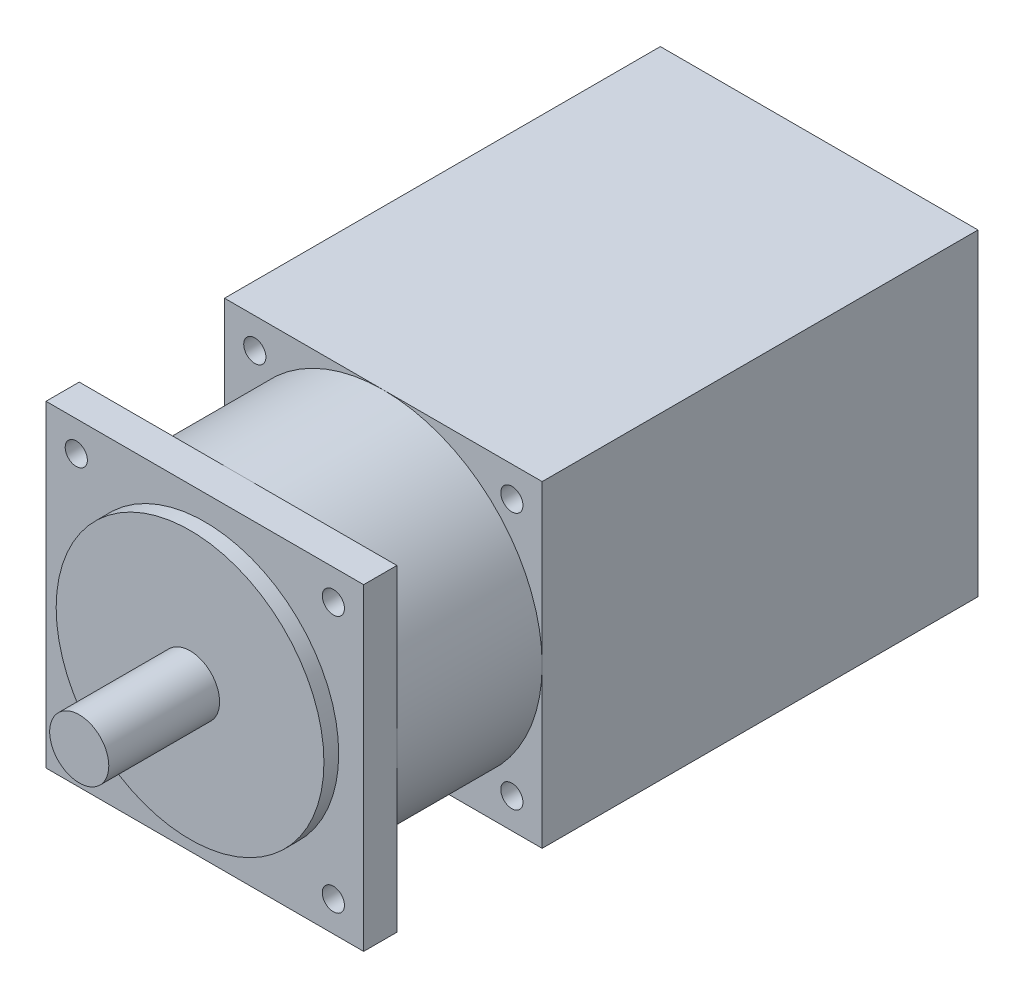
ISO-10303-21;
HEADER;
FILE_DESCRIPTION(('STEP AP214'),'2;1');
FILE_NAME('part.step','',(''),(''),'','','');
FILE_SCHEMA(('AUTOMOTIVE_DESIGN { 1 0 10303 214 1 1 1 1 }'));
ENDSEC;
DATA;
#1=APPLICATION_CONTEXT('core data for automotive mechanical design processes');
#2=APPLICATION_PROTOCOL_DEFINITION('international standard','automotive_design',2000,#1);
#3=PRODUCT_CONTEXT('',#1,'mechanical');
#4=PRODUCT('Part','Part','',(#3));
#5=PRODUCT_RELATED_PRODUCT_CATEGORY('part','',(#4));
#6=PRODUCT_DEFINITION_FORMATION('','',#4);
#7=PRODUCT_DEFINITION_CONTEXT('part definition',#1,'design');
#8=PRODUCT_DEFINITION('design','',#6,#7);
#9=PRODUCT_DEFINITION_SHAPE('','',#8);
#10=(LENGTH_UNIT() NAMED_UNIT(*) SI_UNIT(.MILLI.,.METRE.));
#11=(NAMED_UNIT(*) PLANE_ANGLE_UNIT() SI_UNIT($,.RADIAN.));
#12=(NAMED_UNIT(*) SI_UNIT($,.STERADIAN.) SOLID_ANGLE_UNIT());
#13=UNCERTAINTY_MEASURE_WITH_UNIT(LENGTH_MEASURE(1.E-05),#10,'distance_accuracy_value','');
#14=(GEOMETRIC_REPRESENTATION_CONTEXT(3) GLOBAL_UNCERTAINTY_ASSIGNED_CONTEXT((#13)) GLOBAL_UNIT_ASSIGNED_CONTEXT((#10,
#11,#12)) REPRESENTATION_CONTEXT('',''));
#15=CARTESIAN_POINT('',(0.,0.,0.));
#16=DIRECTION('',(0.,0.,1.));
#17=DIRECTION('',(1.,0.,0.));
#18=AXIS2_PLACEMENT_3D('',#15,#16,#17);
#19=CARTESIAN_POINT('',(0.,0.,118.));
#20=DIRECTION('',(0.,0.,1.));
#21=DIRECTION('',(1.,0.,0.));
#22=AXIS2_PLACEMENT_3D('',#19,#20,#21);
#23=PLANE('',#22);
#24=CARTESIAN_POINT('',(0.,0.,118.));
#25=DIRECTION('',(0.,0.,1.));
#26=DIRECTION('',(1.,0.,0.));
#27=AXIS2_PLACEMENT_3D('',#24,#25,#26);
#28=CIRCLE('',#27,43.);
#29=CARTESIAN_POINT('',(43.,0.,118.));
#30=VERTEX_POINT('',#29);
#31=CARTESIAN_POINT('',(0.,43.,118.));
#32=VERTEX_POINT('',#31);
#33=EDGE_CURVE('E152',#30,#32,#28,.T.);
#34=ORIENTED_EDGE('',*,*,#33,.F.);
#35=DIRECTION('',(0.,1.,0.));
#36=VECTOR('',#35,1.);
#37=CARTESIAN_POINT('',(43.,43.,118.));
#38=LINE('',#37,#36);
#39=CARTESIAN_POINT('',(43.,43.,118.));
#40=VERTEX_POINT('',#39);
#41=EDGE_CURVE('E194',#30,#40,#38,.T.);
#42=ORIENTED_EDGE('',*,*,#41,.T.);
#43=DIRECTION('',(-1.,0.,0.));
#44=VECTOR('',#43,1.);
#45=CARTESIAN_POINT('',(-43.,43.,118.));
#46=LINE('',#45,#44);
#47=EDGE_CURVE('E195',#40,#32,#46,.T.);
#48=ORIENTED_EDGE('',*,*,#47,.T.);
#49=EDGE_LOOP('',(#34,#42,#48));
#50=FACE_BOUND('',#49,.T.);
#51=CARTESIAN_POINT('',(34.8,34.8000000000018,118.));
#52=DIRECTION('',(0.,0.,1.));
#53=DIRECTION('',(1.,0.,0.));
#54=AXIS2_PLACEMENT_3D('',#51,#52,#53);
#55=CIRCLE('',#54,3.000000000002);
#56=CARTESIAN_POINT('',(37.800000000002,34.8000000000018,118.));
#57=VERTEX_POINT('',#56);
#58=EDGE_CURVE('E179',#57,#57,#55,.T.);
#59=ORIENTED_EDGE('',*,*,#58,.F.);
#60=EDGE_LOOP('',(#59));
#61=FACE_BOUND('',#60,.T.);
#62=ADVANCED_FACE('F35',(#50,#61),#23,.T.);
#63=CARTESIAN_POINT('',(-43.,0.,118.));
#64=VERTEX_POINT('',#63);
#65=EDGE_CURVE('E156',#32,#64,#28,.T.);
#66=ORIENTED_EDGE('',*,*,#65,.F.);
#67=CARTESIAN_POINT('',(-43.,43.,118.));
#68=VERTEX_POINT('',#67);
#69=EDGE_CURVE('E193',#32,#68,#46,.T.);
#70=ORIENTED_EDGE('',*,*,#69,.T.);
#71=DIRECTION('',(0.,-1.,0.));
#72=VECTOR('',#71,1.);
#73=CARTESIAN_POINT('',(-43.,43.,118.));
#74=LINE('',#73,#72);
#75=EDGE_CURVE('E199',#68,#64,#74,.T.);
#76=ORIENTED_EDGE('',*,*,#75,.T.);
#77=EDGE_LOOP('',(#66,#70,#76));
#78=FACE_BOUND('',#77,.T.);
#79=CARTESIAN_POINT('',(-34.7999999999999,34.7999999999999,118.));
#80=DIRECTION('',(0.,0.,1.));
#81=DIRECTION('',(1.,0.,0.));
#82=AXIS2_PLACEMENT_3D('',#79,#80,#81);
#83=CIRCLE('',#82,3.);
#84=CARTESIAN_POINT('',(-31.7999999999999,34.7999999999999,118.));
#85=VERTEX_POINT('',#84);
#86=EDGE_CURVE('E185',#85,#85,#83,.T.);
#87=ORIENTED_EDGE('',*,*,#86,.F.);
#88=EDGE_LOOP('',(#87));
#89=FACE_BOUND('',#88,.T.);
#90=ADVANCED_FACE('F322',(#78,#89),#23,.T.);
#91=CARTESIAN_POINT('',(0.,-43.,118.));
#92=VERTEX_POINT('',#91);
#93=EDGE_CURVE('E230',#64,#92,#28,.T.);
#94=ORIENTED_EDGE('',*,*,#93,.F.);
#95=CARTESIAN_POINT('',(-43.,-43.,118.));
#96=VERTEX_POINT('',#95);
#97=EDGE_CURVE('E198',#64,#96,#74,.T.);
#98=ORIENTED_EDGE('',*,*,#97,.T.);
#99=DIRECTION('',(1.,0.,0.));
#100=VECTOR('',#99,1.);
#101=CARTESIAN_POINT('',(-43.,-43.,118.));
#102=LINE('',#101,#100);
#103=EDGE_CURVE('E203',#96,#92,#102,.T.);
#104=ORIENTED_EDGE('',*,*,#103,.T.);
#105=EDGE_LOOP('',(#94,#98,#104));
#106=FACE_BOUND('',#105,.T.);
#107=CARTESIAN_POINT('',(-34.799999999998,-34.7999999999999,118.));
#108=DIRECTION('',(0.,0.,1.));
#109=DIRECTION('',(1.,0.,0.));
#110=AXIS2_PLACEMENT_3D('',#107,#108,#109);
#111=CIRCLE('',#110,3.00000000000103);
#112=CARTESIAN_POINT('',(-31.799999999997,-34.7999999999999,118.));
#113=VERTEX_POINT('',#112);
#114=EDGE_CURVE('E167',#113,#113,#111,.T.);
#115=ORIENTED_EDGE('',*,*,#114,.F.);
#116=EDGE_LOOP('',(#115));
#117=FACE_BOUND('',#116,.T.);
#118=ADVANCED_FACE('F325',(#106,#117),#23,.T.);
#119=EDGE_CURVE('E157',#92,#30,#28,.T.);
#120=ORIENTED_EDGE('',*,*,#119,.F.);
#121=CARTESIAN_POINT('',(43.,-43.,118.));
#122=VERTEX_POINT('',#121);
#123=EDGE_CURVE('E202',#92,#122,#102,.T.);
#124=ORIENTED_EDGE('',*,*,#123,.T.);
#125=EDGE_CURVE('E191',#122,#30,#38,.T.);
#126=ORIENTED_EDGE('',*,*,#125,.T.);
#127=EDGE_LOOP('',(#120,#124,#126));
#128=FACE_BOUND('',#127,.T.);
#129=CARTESIAN_POINT('',(34.8000000000019,-34.799999999998,118.));
#130=DIRECTION('',(0.,0.,1.));
#131=DIRECTION('',(1.,0.,0.));
#132=AXIS2_PLACEMENT_3D('',#129,#130,#131);
#133=CIRCLE('',#132,3.0000000000027);
#134=CARTESIAN_POINT('',(37.8000000000046,-34.799999999998,118.));
#135=VERTEX_POINT('',#134);
#136=EDGE_CURVE('E173',#135,#135,#133,.T.);
#137=ORIENTED_EDGE('',*,*,#136,.F.);
#138=EDGE_LOOP('',(#137));
#139=FACE_BOUND('',#138,.T.);
#140=ADVANCED_FACE('F338',(#128,#139),#23,.T.);
#141=CARTESIAN_POINT('',(0.,0.,0.));
#142=DIRECTION('',(0.,0.,1.));
#143=DIRECTION('',(1.,0.,0.));
#144=AXIS2_PLACEMENT_3D('',#141,#142,#143);
#145=PLANE('',#144);
#146=DIRECTION('',(0.,1.,0.));
#147=VECTOR('',#146,1.);
#148=CARTESIAN_POINT('',(43.,43.,0.));
#149=LINE('',#148,#147);
#150=CARTESIAN_POINT('',(43.,-43.,0.));
#151=VERTEX_POINT('',#150);
#152=CARTESIAN_POINT('',(43.,43.,0.));
#153=VERTEX_POINT('',#152);
#154=EDGE_CURVE('E188',#151,#153,#149,.T.);
#155=ORIENTED_EDGE('',*,*,#154,.F.);
#156=DIRECTION('',(1.,0.,0.));
#157=VECTOR('',#156,1.);
#158=CARTESIAN_POINT('',(-43.,-43.,0.));
#159=LINE('',#158,#157);
#160=CARTESIAN_POINT('',(-43.,-43.,0.));
#161=VERTEX_POINT('',#160);
#162=EDGE_CURVE('E213',#161,#151,#159,.T.);
#163=ORIENTED_EDGE('',*,*,#162,.F.);
#164=DIRECTION('',(0.,-1.,0.));
#165=VECTOR('',#164,1.);
#166=CARTESIAN_POINT('',(-43.,43.,0.));
#167=LINE('',#166,#165);
#168=CARTESIAN_POINT('',(-43.,43.,0.));
#169=VERTEX_POINT('',#168);
#170=EDGE_CURVE('E211',#169,#161,#167,.T.);
#171=ORIENTED_EDGE('',*,*,#170,.F.);
#172=DIRECTION('',(-1.,0.,0.));
#173=VECTOR('',#172,1.);
#174=CARTESIAN_POINT('',(-43.,43.,0.));
#175=LINE('',#174,#173);
#176=EDGE_CURVE('E209',#153,#169,#175,.T.);
#177=ORIENTED_EDGE('',*,*,#176,.F.);
#178=EDGE_LOOP('',(#155,#163,#171,#177));
#179=FACE_BOUND('',#178,.T.);
#180=CARTESIAN_POINT('',(-34.7999999999999,34.7999999999999,0.));
#181=DIRECTION('',(0.,0.,1.));
#182=DIRECTION('',(1.,0.,0.));
#183=AXIS2_PLACEMENT_3D('',#180,#181,#182);
#184=CIRCLE('',#183,3.);
#185=CARTESIAN_POINT('',(-31.7999999999999,34.7999999999999,0.));
#186=VERTEX_POINT('',#185);
#187=EDGE_CURVE('E182',#186,#186,#184,.T.);
#188=ORIENTED_EDGE('',*,*,#187,.T.);
#189=EDGE_LOOP('',(#188));
#190=FACE_BOUND('',#189,.T.);
#191=CARTESIAN_POINT('',(34.8,34.8000000000018,0.));
#192=DIRECTION('',(0.,0.,1.));
#193=DIRECTION('',(1.,0.,0.));
#194=AXIS2_PLACEMENT_3D('',#191,#192,#193);
#195=CIRCLE('',#194,3.000000000002);
#196=CARTESIAN_POINT('',(37.800000000002,34.8000000000018,0.));
#197=VERTEX_POINT('',#196);
#198=EDGE_CURVE('E176',#197,#197,#195,.T.);
#199=ORIENTED_EDGE('',*,*,#198,.T.);
#200=EDGE_LOOP('',(#199));
#201=FACE_BOUND('',#200,.T.);
#202=CARTESIAN_POINT('',(34.8000000000019,-34.799999999998,0.));
#203=DIRECTION('',(0.,0.,1.));
#204=DIRECTION('',(1.,0.,0.));
#205=AXIS2_PLACEMENT_3D('',#202,#203,#204);
#206=CIRCLE('',#205,3.0000000000027);
#207=CARTESIAN_POINT('',(37.8000000000046,-34.799999999998,0.));
#208=VERTEX_POINT('',#207);
#209=EDGE_CURVE('E170',#208,#208,#206,.T.);
#210=ORIENTED_EDGE('',*,*,#209,.T.);
#211=EDGE_LOOP('',(#210));
#212=FACE_BOUND('',#211,.T.);
#213=CARTESIAN_POINT('',(-34.799999999998,-34.7999999999999,0.));
#214=DIRECTION('',(0.,0.,1.));
#215=DIRECTION('',(1.,0.,0.));
#216=AXIS2_PLACEMENT_3D('',#213,#214,#215);
#217=CIRCLE('',#216,3.00000000000103);
#218=CARTESIAN_POINT('',(-31.799999999997,-34.7999999999999,0.));
#219=VERTEX_POINT('',#218);
#220=EDGE_CURVE('E164',#219,#219,#217,.T.);
#221=ORIENTED_EDGE('',*,*,#220,.T.);
#222=EDGE_LOOP('',(#221));
#223=FACE_BOUND('',#222,.T.);
#224=ADVANCED_FACE('F316',(#179,#190,#201,#212,#223),#145,.F.);
#225=CARTESIAN_POINT('',(43.,43.,118.));
#226=DIRECTION('',(-1.,0.,0.));
#227=DIRECTION('',(0.,-1.,0.));
#228=AXIS2_PLACEMENT_3D('',#225,#226,#227);
#229=PLANE('',#228);
#230=ORIENTED_EDGE('',*,*,#154,.T.);
#231=DIRECTION('',(0.,0.,-1.));
#232=VECTOR('',#231,1.);
#233=CARTESIAN_POINT('',(43.,43.,118.));
#234=LINE('',#233,#232);
#235=EDGE_CURVE('E39',#40,#153,#234,.T.);
#236=ORIENTED_EDGE('',*,*,#235,.F.);
#237=ORIENTED_EDGE('',*,*,#41,.F.);
#238=ORIENTED_EDGE('',*,*,#125,.F.);
#239=DIRECTION('',(0.,0.,-1.));
#240=VECTOR('',#239,1.);
#241=CARTESIAN_POINT('',(43.,-43.,118.));
#242=LINE('',#241,#240);
#243=EDGE_CURVE('E206',#122,#151,#242,.T.);
#244=ORIENTED_EDGE('',*,*,#243,.T.);
#245=EDGE_LOOP('',(#230,#236,#237,#238,#244));
#246=FACE_BOUND('',#245,.T.);
#247=ADVANCED_FACE('F37',(#246),#229,.F.);
#248=CARTESIAN_POINT('',(-43.,43.,118.));
#249=DIRECTION('',(0.,-1.,0.));
#250=DIRECTION('',(0.,0.,-1.));
#251=AXIS2_PLACEMENT_3D('',#248,#249,#250);
#252=PLANE('',#251);
#253=ORIENTED_EDGE('',*,*,#176,.T.);
#254=DIRECTION('',(0.,0.,-1.));
#255=VECTOR('',#254,1.);
#256=CARTESIAN_POINT('',(-43.,43.,118.));
#257=LINE('',#256,#255);
#258=EDGE_CURVE('E219',#68,#169,#257,.T.);
#259=ORIENTED_EDGE('',*,*,#258,.F.);
#260=ORIENTED_EDGE('',*,*,#69,.F.);
#261=ORIENTED_EDGE('',*,*,#47,.F.);
#262=ORIENTED_EDGE('',*,*,#235,.T.);
#263=EDGE_LOOP('',(#253,#259,#260,#261,#262));
#264=FACE_BOUND('',#263,.T.);
#265=ADVANCED_FACE('F309',(#264),#252,.F.);
#266=CARTESIAN_POINT('',(-43.,43.,118.));
#267=DIRECTION('',(1.,0.,0.));
#268=DIRECTION('',(0.,1.,0.));
#269=AXIS2_PLACEMENT_3D('',#266,#267,#268);
#270=PLANE('',#269);
#271=ORIENTED_EDGE('',*,*,#170,.T.);
#272=DIRECTION('',(0.,0.,-1.));
#273=VECTOR('',#272,1.);
#274=CARTESIAN_POINT('',(-43.,-43.,118.));
#275=LINE('',#274,#273);
#276=EDGE_CURVE('E217',#96,#161,#275,.T.);
#277=ORIENTED_EDGE('',*,*,#276,.F.);
#278=ORIENTED_EDGE('',*,*,#97,.F.);
#279=ORIENTED_EDGE('',*,*,#75,.F.);
#280=ORIENTED_EDGE('',*,*,#258,.T.);
#281=EDGE_LOOP('',(#271,#277,#278,#279,#280));
#282=FACE_BOUND('',#281,.T.);
#283=ADVANCED_FACE('F319',(#282),#270,.F.);
#284=CARTESIAN_POINT('',(-43.,-43.,118.));
#285=DIRECTION('',(0.,1.,0.));
#286=DIRECTION('',(0.,0.,1.));
#287=AXIS2_PLACEMENT_3D('',#284,#285,#286);
#288=PLANE('',#287);
#289=ORIENTED_EDGE('',*,*,#162,.T.);
#290=ORIENTED_EDGE('',*,*,#243,.F.);
#291=ORIENTED_EDGE('',*,*,#123,.F.);
#292=ORIENTED_EDGE('',*,*,#103,.F.);
#293=ORIENTED_EDGE('',*,*,#276,.T.);
#294=EDGE_LOOP('',(#289,#290,#291,#292,#293));
#295=FACE_BOUND('',#294,.T.);
#296=ADVANCED_FACE('F333',(#295),#288,.F.);
#297=CARTESIAN_POINT('',(-34.7999999999999,34.7999999999999,118.));
#298=DIRECTION('',(0.,0.,-1.));
#299=DIRECTION('',(-1.,0.,0.));
#300=AXIS2_PLACEMENT_3D('',#297,#298,#299);
#301=CYLINDRICAL_SURFACE('',#300,3.);
#302=ORIENTED_EDGE('',*,*,#86,.T.);
#303=EDGE_LOOP('',(#302));
#304=FACE_BOUND('',#303,.T.);
#305=ORIENTED_EDGE('',*,*,#187,.F.);
#306=EDGE_LOOP('',(#305));
#307=FACE_BOUND('',#306,.T.);
#308=ADVANCED_FACE('F329',(#304,#307),#301,.F.);
#309=CARTESIAN_POINT('',(34.8,34.8000000000018,118.));
#310=DIRECTION('',(0.,0.,-1.));
#311=DIRECTION('',(-1.,0.,0.));
#312=AXIS2_PLACEMENT_3D('',#309,#310,#311);
#313=CYLINDRICAL_SURFACE('',#312,3.000000000002);
#314=ORIENTED_EDGE('',*,*,#58,.T.);
#315=EDGE_LOOP('',(#314));
#316=FACE_BOUND('',#315,.T.);
#317=ORIENTED_EDGE('',*,*,#198,.F.);
#318=EDGE_LOOP('',(#317));
#319=FACE_BOUND('',#318,.T.);
#320=ADVANCED_FACE('F332',(#316,#319),#313,.F.);
#321=CARTESIAN_POINT('',(34.8000000000019,-34.799999999998,118.));
#322=DIRECTION('',(0.,0.,-1.));
#323=DIRECTION('',(-1.,0.,0.));
#324=AXIS2_PLACEMENT_3D('',#321,#322,#323);
#325=CYLINDRICAL_SURFACE('',#324,3.0000000000027);
#326=ORIENTED_EDGE('',*,*,#136,.T.);
#327=EDGE_LOOP('',(#326));
#328=FACE_BOUND('',#327,.T.);
#329=ORIENTED_EDGE('',*,*,#209,.F.);
#330=EDGE_LOOP('',(#329));
#331=FACE_BOUND('',#330,.T.);
#332=ADVANCED_FACE('F347',(#328,#331),#325,.F.);
#333=CARTESIAN_POINT('',(-34.799999999998,-34.7999999999999,118.));
#334=DIRECTION('',(0.,0.,-1.));
#335=DIRECTION('',(-1.,0.,0.));
#336=AXIS2_PLACEMENT_3D('',#333,#334,#335);
#337=CYLINDRICAL_SURFACE('',#336,3.00000000000103);
#338=ORIENTED_EDGE('',*,*,#114,.T.);
#339=EDGE_LOOP('',(#338));
#340=FACE_BOUND('',#339,.T.);
#341=ORIENTED_EDGE('',*,*,#220,.F.);
#342=EDGE_LOOP('',(#341));
#343=FACE_BOUND('',#342,.T.);
#344=ADVANCED_FACE('F302',(#340,#343),#337,.F.);
#345=CARTESIAN_POINT('',(0.,0.,157.333333333333));
#346=DIRECTION('',(0.,0.,-1.));
#347=DIRECTION('',(-1.,0.,0.));
#348=AXIS2_PLACEMENT_3D('',#345,#346,#347);
#349=CYLINDRICAL_SURFACE('',#348,43.);
#350=CARTESIAN_POINT('',(0.,0.,157.333333333333));
#351=DIRECTION('',(0.,0.,1.));
#352=DIRECTION('',(1.,0.,0.));
#353=AXIS2_PLACEMENT_3D('',#350,#351,#352);
#354=CIRCLE('',#353,43.);
#355=CARTESIAN_POINT('',(43.,0.,157.333333333333));
#356=VERTEX_POINT('',#355);
#357=CARTESIAN_POINT('',(0.,43.,157.333333333333));
#358=VERTEX_POINT('',#357);
#359=EDGE_CURVE('E162',#356,#358,#354,.T.);
#360=ORIENTED_EDGE('',*,*,#359,.F.);
#361=CARTESIAN_POINT('',(0.,-43.,157.333333333333));
#362=VERTEX_POINT('',#361);
#363=EDGE_CURVE('E52',#362,#356,#354,.T.);
#364=ORIENTED_EDGE('',*,*,#363,.F.);
#365=CARTESIAN_POINT('',(-43.,0.,157.333333333333));
#366=VERTEX_POINT('',#365);
#367=EDGE_CURVE('E56',#366,#362,#354,.T.);
#368=ORIENTED_EDGE('',*,*,#367,.F.);
#369=EDGE_CURVE('E165',#358,#366,#354,.T.);
#370=ORIENTED_EDGE('',*,*,#369,.F.);
#371=EDGE_LOOP('',(#360,#364,#368,#370));
#372=FACE_BOUND('',#371,.T.);
#373=ORIENTED_EDGE('',*,*,#33,.T.);
#374=ORIENTED_EDGE('',*,*,#65,.T.);
#375=ORIENTED_EDGE('',*,*,#93,.T.);
#376=ORIENTED_EDGE('',*,*,#119,.T.);
#377=EDGE_LOOP('',(#373,#374,#375,#376));
#378=FACE_BOUND('',#377,.T.);
#379=ADVANCED_FACE('F300',(#372,#378),#349,.T.);
#380=CARTESIAN_POINT('',(0.,0.,157.333333333333));
#381=DIRECTION('',(0.,0.,-1.));
#382=DIRECTION('',(-1.,0.,0.));
#383=AXIS2_PLACEMENT_3D('',#380,#381,#382);
#384=PLANE('',#383);
#385=CARTESIAN_POINT('',(34.8,34.8000000000019,157.333333333333));
#386=DIRECTION('',(0.,0.,1.));
#387=DIRECTION('',(1.,0.,0.));
#388=AXIS2_PLACEMENT_3D('',#385,#386,#387);
#389=CIRCLE('',#388,3.00000000000202);
#390=CARTESIAN_POINT('',(37.800000000002,34.8000000000019,157.333333333333));
#391=VERTEX_POINT('',#390);
#392=EDGE_CURVE('E251',#391,#391,#389,.T.);
#393=ORIENTED_EDGE('',*,*,#392,.T.);
#394=EDGE_LOOP('',(#393));
#395=FACE_BOUND('',#394,.T.);
#396=DIRECTION('',(0.,1.,0.));
#397=VECTOR('',#396,1.);
#398=CARTESIAN_POINT('',(43.,-43.,157.333333333333));
#399=LINE('',#398,#397);
#400=CARTESIAN_POINT('',(43.,43.,157.333333333333));
#401=VERTEX_POINT('',#400);
#402=EDGE_CURVE('E150',#356,#401,#399,.T.);
#403=ORIENTED_EDGE('',*,*,#402,.F.);
#404=ORIENTED_EDGE('',*,*,#359,.T.);
#405=DIRECTION('',(-1.,0.,0.));
#406=VECTOR('',#405,1.);
#407=CARTESIAN_POINT('',(-43.,43.,157.333333333333));
#408=LINE('',#407,#406);
#409=EDGE_CURVE('E271',#401,#358,#408,.T.);
#410=ORIENTED_EDGE('',*,*,#409,.F.);
#411=EDGE_LOOP('',(#403,#404,#410));
#412=FACE_BOUND('',#411,.T.);
#413=ADVANCED_FACE('F294',(#395,#412),#384,.T.);
#414=CARTESIAN_POINT('',(-34.8,34.8,157.333333333333));
#415=DIRECTION('',(0.,0.,1.));
#416=DIRECTION('',(1.,0.,0.));
#417=AXIS2_PLACEMENT_3D('',#414,#415,#416);
#418=CIRCLE('',#417,3.);
#419=CARTESIAN_POINT('',(-31.8,34.8,157.333333333333));
#420=VERTEX_POINT('',#419);
#421=EDGE_CURVE('E257',#420,#420,#418,.T.);
#422=ORIENTED_EDGE('',*,*,#421,.T.);
#423=EDGE_LOOP('',(#422));
#424=FACE_BOUND('',#423,.T.);
#425=CARTESIAN_POINT('',(-43.,43.,157.333333333333));
#426=VERTEX_POINT('',#425);
#427=EDGE_CURVE('E270',#358,#426,#408,.T.);
#428=ORIENTED_EDGE('',*,*,#427,.F.);
#429=ORIENTED_EDGE('',*,*,#369,.T.);
#430=DIRECTION('',(0.,-1.,0.));
#431=VECTOR('',#430,1.);
#432=CARTESIAN_POINT('',(-43.,-43.,157.333333333333));
#433=LINE('',#432,#431);
#434=EDGE_CURVE('E274',#426,#366,#433,.T.);
#435=ORIENTED_EDGE('',*,*,#434,.F.);
#436=EDGE_LOOP('',(#428,#429,#435));
#437=FACE_BOUND('',#436,.T.);
#438=ADVANCED_FACE('F299',(#424,#437),#384,.T.);
#439=CARTESIAN_POINT('',(-34.799999999998,-34.8,157.333333333333));
#440=DIRECTION('',(0.,0.,1.));
#441=DIRECTION('',(1.,0.,0.));
#442=AXIS2_PLACEMENT_3D('',#439,#440,#441);
#443=CIRCLE('',#442,3.00000000000106);
#444=CARTESIAN_POINT('',(-31.799999999997,-34.8,157.333333333333));
#445=VERTEX_POINT('',#444);
#446=EDGE_CURVE('E245',#445,#445,#443,.T.);
#447=ORIENTED_EDGE('',*,*,#446,.T.);
#448=EDGE_LOOP('',(#447));
#449=FACE_BOUND('',#448,.T.);
#450=CARTESIAN_POINT('',(-43.,-43.,157.333333333333));
#451=VERTEX_POINT('',#450);
#452=EDGE_CURVE('E273',#366,#451,#433,.T.);
#453=ORIENTED_EDGE('',*,*,#452,.F.);
#454=ORIENTED_EDGE('',*,*,#367,.T.);
#455=DIRECTION('',(1.,0.,0.));
#456=VECTOR('',#455,1.);
#457=CARTESIAN_POINT('',(-43.,-43.,157.333333333333));
#458=LINE('',#457,#456);
#459=EDGE_CURVE('E145',#451,#362,#458,.T.);
#460=ORIENTED_EDGE('',*,*,#459,.F.);
#461=EDGE_LOOP('',(#453,#454,#460));
#462=FACE_BOUND('',#461,.T.);
#463=ADVANCED_FACE('F288',(#449,#462),#384,.T.);
#464=CARTESIAN_POINT('',(0.,0.,166.333333333333));
#465=DIRECTION('',(0.,0.,-1.));
#466=DIRECTION('',(-1.,0.,0.));
#467=AXIS2_PLACEMENT_3D('',#464,#465,#466);
#468=PLANE('',#467);
#469=CARTESIAN_POINT('',(0.,0.,166.333333333333));
#470=DIRECTION('',(0.,0.,1.));
#471=DIRECTION('',(1.,0.,0.));
#472=AXIS2_PLACEMENT_3D('',#469,#470,#471);
#473=CIRCLE('',#472,36.25);
#474=CARTESIAN_POINT('',(36.25,0.,166.333333333333));
#475=VERTEX_POINT('',#474);
#476=EDGE_CURVE('E44',#475,#475,#473,.T.);
#477=ORIENTED_EDGE('',*,*,#476,.F.);
#478=EDGE_LOOP('',(#477));
#479=FACE_BOUND('',#478,.T.);
#480=DIRECTION('',(0.,1.,0.));
#481=VECTOR('',#480,1.);
#482=CARTESIAN_POINT('',(43.,-43.,166.333333333333));
#483=LINE('',#482,#481);
#484=CARTESIAN_POINT('',(43.,-43.,166.333333333333));
#485=VERTEX_POINT('',#484);
#486=CARTESIAN_POINT('',(43.,43.,166.333333333333));
#487=VERTEX_POINT('',#486);
#488=EDGE_CURVE('E135',#485,#487,#483,.T.);
#489=ORIENTED_EDGE('',*,*,#488,.T.);
#490=DIRECTION('',(-1.,0.,0.));
#491=VECTOR('',#490,1.);
#492=CARTESIAN_POINT('',(-43.,43.,166.333333333333));
#493=LINE('',#492,#491);
#494=CARTESIAN_POINT('',(-43.,43.,166.333333333333));
#495=VERTEX_POINT('',#494);
#496=EDGE_CURVE('E124',#487,#495,#493,.T.);
#497=ORIENTED_EDGE('',*,*,#496,.T.);
#498=DIRECTION('',(0.,-1.,0.));
#499=VECTOR('',#498,1.);
#500=CARTESIAN_POINT('',(-43.,-43.,166.333333333333));
#501=LINE('',#500,#499);
#502=CARTESIAN_POINT('',(-43.,-43.,166.333333333333));
#503=VERTEX_POINT('',#502);
#504=EDGE_CURVE('E134',#495,#503,#501,.T.);
#505=ORIENTED_EDGE('',*,*,#504,.T.);
#506=DIRECTION('',(1.,0.,0.));
#507=VECTOR('',#506,1.);
#508=CARTESIAN_POINT('',(-43.,-43.,166.333333333333));
#509=LINE('',#508,#507);
#510=EDGE_CURVE('E141',#503,#485,#509,.T.);
#511=ORIENTED_EDGE('',*,*,#510,.T.);
#512=EDGE_LOOP('',(#489,#497,#505,#511));
#513=FACE_BOUND('',#512,.T.);
#514=CARTESIAN_POINT('',(-34.8,34.8,166.333333333333));
#515=DIRECTION('',(0.,0.,1.));
#516=DIRECTION('',(1.,0.,0.));
#517=AXIS2_PLACEMENT_3D('',#514,#515,#516);
#518=CIRCLE('',#517,3.);
#519=CARTESIAN_POINT('',(-31.8,34.8,166.333333333333));
#520=VERTEX_POINT('',#519);
#521=EDGE_CURVE('E260',#520,#520,#518,.T.);
#522=ORIENTED_EDGE('',*,*,#521,.F.);
#523=EDGE_LOOP('',(#522));
#524=FACE_BOUND('',#523,.T.);
#525=CARTESIAN_POINT('',(34.8,34.8000000000019,166.333333333333));
#526=DIRECTION('',(0.,0.,1.));
#527=DIRECTION('',(1.,0.,0.));
#528=AXIS2_PLACEMENT_3D('',#525,#526,#527);
#529=CIRCLE('',#528,3.00000000000202);
#530=CARTESIAN_POINT('',(37.800000000002,34.8000000000019,166.333333333333));
#531=VERTEX_POINT('',#530);
#532=EDGE_CURVE('E254',#531,#531,#529,.T.);
#533=ORIENTED_EDGE('',*,*,#532,.F.);
#534=EDGE_LOOP('',(#533));
#535=FACE_BOUND('',#534,.T.);
#536=CARTESIAN_POINT('',(34.800000000002,-34.799999999998,166.333333333333));
#537=DIRECTION('',(0.,0.,1.));
#538=DIRECTION('',(1.,0.,0.));
#539=AXIS2_PLACEMENT_3D('',#536,#537,#538);
#540=CIRCLE('',#539,3.00000000000278);
#541=CARTESIAN_POINT('',(37.8000000000048,-34.799999999998,166.333333333333));
#542=VERTEX_POINT('',#541);
#543=EDGE_CURVE('E248',#542,#542,#540,.T.);
#544=ORIENTED_EDGE('',*,*,#543,.F.);
#545=EDGE_LOOP('',(#544));
#546=FACE_BOUND('',#545,.T.);
#547=CARTESIAN_POINT('',(-34.799999999998,-34.8,166.333333333333));
#548=DIRECTION('',(0.,0.,1.));
#549=DIRECTION('',(1.,0.,0.));
#550=AXIS2_PLACEMENT_3D('',#547,#548,#549);
#551=CIRCLE('',#550,3.00000000000106);
#552=CARTESIAN_POINT('',(-31.799999999997,-34.8,166.333333333333));
#553=VERTEX_POINT('',#552);
#554=EDGE_CURVE('E241',#553,#553,#551,.T.);
#555=ORIENTED_EDGE('',*,*,#554,.F.);
#556=EDGE_LOOP('',(#555));
#557=FACE_BOUND('',#556,.T.);
#558=ADVANCED_FACE('F138',(#479,#513,#524,#535,#546,#557),#468,.F.);
#559=CARTESIAN_POINT('',(34.800000000002,-34.799999999998,157.333333333333));
#560=DIRECTION('',(0.,0.,1.));
#561=DIRECTION('',(1.,0.,0.));
#562=AXIS2_PLACEMENT_3D('',#559,#560,#561);
#563=CIRCLE('',#562,3.00000000000278);
#564=CARTESIAN_POINT('',(37.8000000000048,-34.799999999998,157.333333333333));
#565=VERTEX_POINT('',#564);
#566=EDGE_CURVE('E244',#565,#565,#563,.T.);
#567=ORIENTED_EDGE('',*,*,#566,.T.);
#568=EDGE_LOOP('',(#567));
#569=FACE_BOUND('',#568,.T.);
#570=CARTESIAN_POINT('',(43.,-43.,157.333333333333));
#571=VERTEX_POINT('',#570);
#572=EDGE_CURVE('E277',#362,#571,#458,.T.);
#573=ORIENTED_EDGE('',*,*,#572,.F.);
#574=ORIENTED_EDGE('',*,*,#363,.T.);
#575=EDGE_CURVE('E268',#571,#356,#399,.T.);
#576=ORIENTED_EDGE('',*,*,#575,.F.);
#577=EDGE_LOOP('',(#573,#574,#576));
#578=FACE_BOUND('',#577,.T.);
#579=ADVANCED_FACE('F292',(#569,#578),#384,.T.);
#580=CARTESIAN_POINT('',(43.,-43.,166.333333333333));
#581=DIRECTION('',(-1.,0.,0.));
#582=DIRECTION('',(0.,0.,1.));
#583=AXIS2_PLACEMENT_3D('',#580,#581,#582);
#584=PLANE('',#583);
#585=ORIENTED_EDGE('',*,*,#575,.T.);
#586=ORIENTED_EDGE('',*,*,#402,.T.);
#587=DIRECTION('',(0.,0.,-1.));
#588=VECTOR('',#587,1.);
#589=CARTESIAN_POINT('',(43.,43.,166.333333333333));
#590=LINE('',#589,#588);
#591=EDGE_CURVE('E129',#487,#401,#590,.T.);
#592=ORIENTED_EDGE('',*,*,#591,.F.);
#593=ORIENTED_EDGE('',*,*,#488,.F.);
#594=DIRECTION('',(0.,0.,-1.));
#595=VECTOR('',#594,1.);
#596=CARTESIAN_POINT('',(43.,-43.,166.333333333333));
#597=LINE('',#596,#595);
#598=EDGE_CURVE('E267',#485,#571,#597,.T.);
#599=ORIENTED_EDGE('',*,*,#598,.T.);
#600=EDGE_LOOP('',(#585,#586,#592,#593,#599));
#601=FACE_BOUND('',#600,.T.);
#602=ADVANCED_FACE('F148',(#601),#584,.F.);
#603=CARTESIAN_POINT('',(-43.,43.,166.333333333333));
#604=DIRECTION('',(0.,-1.,0.));
#605=DIRECTION('',(0.,0.,-1.));
#606=AXIS2_PLACEMENT_3D('',#603,#604,#605);
#607=PLANE('',#606);
#608=ORIENTED_EDGE('',*,*,#409,.T.);
#609=ORIENTED_EDGE('',*,*,#427,.T.);
#610=DIRECTION('',(0.,0.,-1.));
#611=VECTOR('',#610,1.);
#612=CARTESIAN_POINT('',(-43.,43.,166.333333333333));
#613=LINE('',#612,#611);
#614=EDGE_CURVE('E131',#495,#426,#613,.T.);
#615=ORIENTED_EDGE('',*,*,#614,.F.);
#616=ORIENTED_EDGE('',*,*,#496,.F.);
#617=ORIENTED_EDGE('',*,*,#591,.T.);
#618=EDGE_LOOP('',(#608,#609,#615,#616,#617));
#619=FACE_BOUND('',#618,.T.);
#620=ADVANCED_FACE('F127',(#619),#607,.F.);
#621=CARTESIAN_POINT('',(-43.,-43.,166.333333333333));
#622=DIRECTION('',(1.,0.,0.));
#623=DIRECTION('',(0.,0.,-1.));
#624=AXIS2_PLACEMENT_3D('',#621,#622,#623);
#625=PLANE('',#624);
#626=ORIENTED_EDGE('',*,*,#434,.T.);
#627=ORIENTED_EDGE('',*,*,#452,.T.);
#628=DIRECTION('',(0.,0.,-1.));
#629=VECTOR('',#628,1.);
#630=CARTESIAN_POINT('',(-43.,-43.,166.333333333333));
#631=LINE('',#630,#629);
#632=EDGE_CURVE('E158',#503,#451,#631,.T.);
#633=ORIENTED_EDGE('',*,*,#632,.F.);
#634=ORIENTED_EDGE('',*,*,#504,.F.);
#635=ORIENTED_EDGE('',*,*,#614,.T.);
#636=EDGE_LOOP('',(#626,#627,#633,#634,#635));
#637=FACE_BOUND('',#636,.T.);
#638=ADVANCED_FACE('F298',(#637),#625,.F.);
#639=CARTESIAN_POINT('',(-43.,-43.,166.333333333333));
#640=DIRECTION('',(0.,1.,0.));
#641=DIRECTION('',(0.,0.,1.));
#642=AXIS2_PLACEMENT_3D('',#639,#640,#641);
#643=PLANE('',#642);
#644=ORIENTED_EDGE('',*,*,#459,.T.);
#645=ORIENTED_EDGE('',*,*,#572,.T.);
#646=ORIENTED_EDGE('',*,*,#598,.F.);
#647=ORIENTED_EDGE('',*,*,#510,.F.);
#648=ORIENTED_EDGE('',*,*,#632,.T.);
#649=EDGE_LOOP('',(#644,#645,#646,#647,#648));
#650=FACE_BOUND('',#649,.T.);
#651=ADVANCED_FACE('F284',(#650),#643,.F.);
#652=CARTESIAN_POINT('',(-34.8,34.8,166.333333333333));
#653=DIRECTION('',(0.,0.,-1.));
#654=DIRECTION('',(-1.,0.,0.));
#655=AXIS2_PLACEMENT_3D('',#652,#653,#654);
#656=CYLINDRICAL_SURFACE('',#655,3.);
#657=ORIENTED_EDGE('',*,*,#521,.T.);
#658=EDGE_LOOP('',(#657));
#659=FACE_BOUND('',#658,.T.);
#660=ORIENTED_EDGE('',*,*,#421,.F.);
#661=EDGE_LOOP('',(#660));
#662=FACE_BOUND('',#661,.T.);
#663=ADVANCED_FACE('F509',(#659,#662),#656,.F.);
#664=CARTESIAN_POINT('',(34.8,34.8000000000019,166.333333333333));
#665=DIRECTION('',(0.,0.,-1.));
#666=DIRECTION('',(-1.,0.,0.));
#667=AXIS2_PLACEMENT_3D('',#664,#665,#666);
#668=CYLINDRICAL_SURFACE('',#667,3.00000000000202);
#669=ORIENTED_EDGE('',*,*,#532,.T.);
#670=EDGE_LOOP('',(#669));
#671=FACE_BOUND('',#670,.T.);
#672=ORIENTED_EDGE('',*,*,#392,.F.);
#673=EDGE_LOOP('',(#672));
#674=FACE_BOUND('',#673,.T.);
#675=ADVANCED_FACE('F517',(#671,#674),#668,.F.);
#676=CARTESIAN_POINT('',(34.800000000002,-34.799999999998,166.333333333333));
#677=DIRECTION('',(0.,0.,-1.));
#678=DIRECTION('',(-1.,0.,0.));
#679=AXIS2_PLACEMENT_3D('',#676,#677,#678);
#680=CYLINDRICAL_SURFACE('',#679,3.00000000000278);
#681=ORIENTED_EDGE('',*,*,#543,.T.);
#682=EDGE_LOOP('',(#681));
#683=FACE_BOUND('',#682,.T.);
#684=ORIENTED_EDGE('',*,*,#566,.F.);
#685=EDGE_LOOP('',(#684));
#686=FACE_BOUND('',#685,.T.);
#687=ADVANCED_FACE('F526',(#683,#686),#680,.F.);
#688=CARTESIAN_POINT('',(-34.799999999998,-34.8,166.333333333333));
#689=DIRECTION('',(0.,0.,-1.));
#690=DIRECTION('',(-1.,0.,0.));
#691=AXIS2_PLACEMENT_3D('',#688,#689,#690);
#692=CYLINDRICAL_SURFACE('',#691,3.00000000000106);
#693=ORIENTED_EDGE('',*,*,#554,.T.);
#694=EDGE_LOOP('',(#693));
#695=FACE_BOUND('',#694,.T.);
#696=ORIENTED_EDGE('',*,*,#446,.F.);
#697=EDGE_LOOP('',(#696));
#698=FACE_BOUND('',#697,.T.);
#699=ADVANCED_FACE('F535',(#695,#698),#692,.F.);
#700=CARTESIAN_POINT('',(0.,0.,170.333333333333));
#701=DIRECTION('',(0.,0.,-1.));
#702=DIRECTION('',(-1.,0.,0.));
#703=AXIS2_PLACEMENT_3D('',#700,#701,#702);
#704=CYLINDRICAL_SURFACE('',#703,36.25);
#705=CARTESIAN_POINT('',(0.,0.,170.333333333333));
#706=DIRECTION('',(0.,0.,1.));
#707=DIRECTION('',(1.,0.,0.));
#708=AXIS2_PLACEMENT_3D('',#705,#706,#707);
#709=CIRCLE('',#708,36.25);
#710=CARTESIAN_POINT('',(36.25,0.,170.333333333333));
#711=VERTEX_POINT('',#710);
#712=EDGE_CURVE('E240',#711,#711,#709,.T.);
#713=ORIENTED_EDGE('',*,*,#712,.F.);
#714=EDGE_LOOP('',(#713));
#715=FACE_BOUND('',#714,.T.);
#716=ORIENTED_EDGE('',*,*,#476,.T.);
#717=EDGE_LOOP('',(#716));
#718=FACE_BOUND('',#717,.T.);
#719=ADVANCED_FACE('F543',(#715,#718),#704,.T.);
#720=CARTESIAN_POINT('',(0.,0.,170.333333333333));
#721=DIRECTION('',(0.,0.,1.));
#722=DIRECTION('',(1.,0.,0.));
#723=AXIS2_PLACEMENT_3D('',#720,#721,#722);
#724=PLANE('',#723);
#725=CARTESIAN_POINT('',(0.,0.,170.333333333333));
#726=DIRECTION('',(0.,0.,1.));
#727=DIRECTION('',(1.,0.,0.));
#728=AXIS2_PLACEMENT_3D('',#725,#726,#727);
#729=CIRCLE('',#728,8.);
#730=CARTESIAN_POINT('',(8.,0.,170.333333333333));
#731=VERTEX_POINT('',#730);
#732=EDGE_CURVE('E11',#731,#731,#729,.T.);
#733=ORIENTED_EDGE('',*,*,#732,.F.);
#734=EDGE_LOOP('',(#733));
#735=FACE_BOUND('',#734,.T.);
#736=ORIENTED_EDGE('',*,*,#712,.T.);
#737=EDGE_LOOP('',(#736));
#738=FACE_BOUND('',#737,.T.);
#739=ADVANCED_FACE('F551',(#735,#738),#724,.T.);
#740=CARTESIAN_POINT('',(0.,0.,200.333333333333));
#741=DIRECTION('',(0.,0.,-1.));
#742=DIRECTION('',(-1.,0.,0.));
#743=AXIS2_PLACEMENT_3D('',#740,#741,#742);
#744=CYLINDRICAL_SURFACE('',#743,8.);
#745=CARTESIAN_POINT('',(0.,0.,200.333333333333));
#746=DIRECTION('',(0.,0.,1.));
#747=DIRECTION('',(1.,0.,0.));
#748=AXIS2_PLACEMENT_3D('',#745,#746,#747);
#749=CIRCLE('',#748,8.);
#750=CARTESIAN_POINT('',(8.,0.,200.333333333333));
#751=VERTEX_POINT('',#750);
#752=EDGE_CURVE('E600',#751,#751,#749,.T.);
#753=ORIENTED_EDGE('',*,*,#752,.F.);
#754=EDGE_LOOP('',(#753));
#755=FACE_BOUND('',#754,.T.);
#756=ORIENTED_EDGE('',*,*,#732,.T.);
#757=EDGE_LOOP('',(#756));
#758=FACE_BOUND('',#757,.T.);
#759=ADVANCED_FACE('F560',(#755,#758),#744,.T.);
#760=CARTESIAN_POINT('',(0.,0.,200.333333333333));
#761=DIRECTION('',(0.,0.,1.));
#762=DIRECTION('',(1.,0.,0.));
#763=AXIS2_PLACEMENT_3D('',#760,#761,#762);
#764=PLANE('',#763);
#765=ORIENTED_EDGE('',*,*,#752,.T.);
#766=EDGE_LOOP('',(#765));
#767=FACE_BOUND('',#766,.T.);
#768=ADVANCED_FACE('F569',(#767),#764,.T.);
#769=CLOSED_SHELL('',(#62,#90,#118,#140,#224,#247,#265,#283,#296,#308,#320,#332,#344,#379,#413,
#438,#463,#558,#579,#602,#620,#638,#651,#663,#675,#687,#699,#719,#739,#759,#768));
#770=MANIFOLD_SOLID_BREP('B2',#769);
#771=ADVANCED_BREP_SHAPE_REPRESENTATION('',(#18,#770),#14);
#772=SHAPE_DEFINITION_REPRESENTATION(#9,#771);
ENDSEC;
END-ISO-10303-21;
